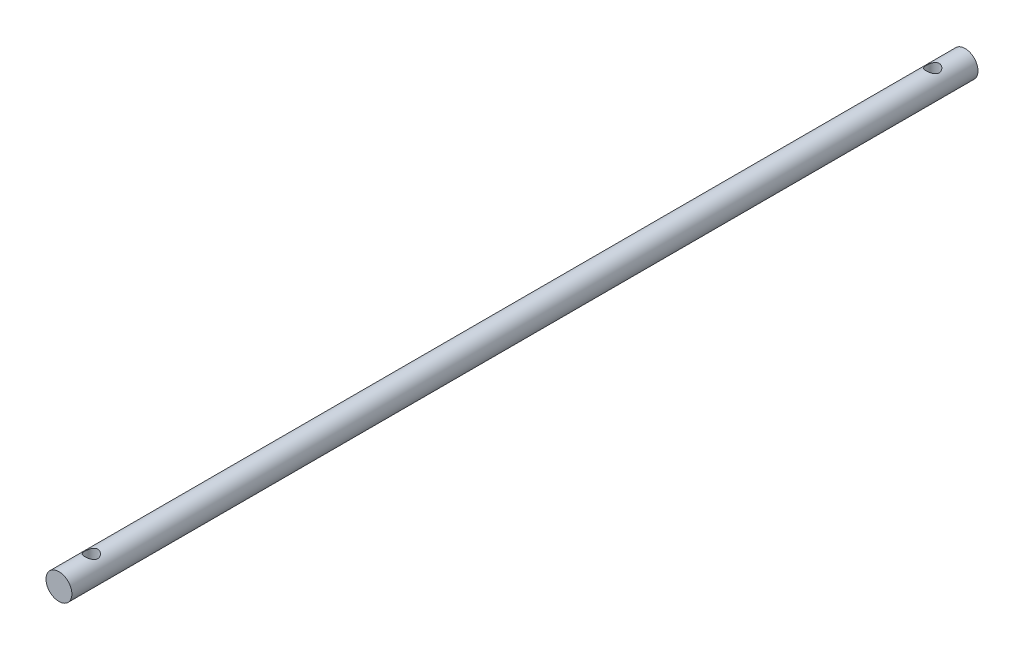
ISO-10303-21;
HEADER;
FILE_DESCRIPTION(('STEP AP214'),'2;1');
FILE_NAME('part.step','',(''),(''),'','','');
FILE_SCHEMA(('AUTOMOTIVE_DESIGN { 1 0 10303 214 1 1 1 1 }'));
ENDSEC;
DATA;
#1=APPLICATION_CONTEXT('core data for automotive mechanical design processes');
#2=APPLICATION_PROTOCOL_DEFINITION('international standard','automotive_design',2000,#1);
#3=PRODUCT_CONTEXT('',#1,'mechanical');
#4=PRODUCT('Part','Part','',(#3));
#5=PRODUCT_RELATED_PRODUCT_CATEGORY('part','',(#4));
#6=PRODUCT_DEFINITION_FORMATION('','',#4);
#7=PRODUCT_DEFINITION_CONTEXT('part definition',#1,'design');
#8=PRODUCT_DEFINITION('design','',#6,#7);
#9=PRODUCT_DEFINITION_SHAPE('','',#8);
#10=(LENGTH_UNIT() NAMED_UNIT(*) SI_UNIT(.MILLI.,.METRE.));
#11=(NAMED_UNIT(*) PLANE_ANGLE_UNIT() SI_UNIT($,.RADIAN.));
#12=(NAMED_UNIT(*) SI_UNIT($,.STERADIAN.) SOLID_ANGLE_UNIT());
#13=UNCERTAINTY_MEASURE_WITH_UNIT(LENGTH_MEASURE(1.E-05),#10,'distance_accuracy_value','');
#14=(GEOMETRIC_REPRESENTATION_CONTEXT(3) GLOBAL_UNCERTAINTY_ASSIGNED_CONTEXT((#13)) GLOBAL_UNIT_ASSIGNED_CONTEXT((#10,
#11,#12)) REPRESENTATION_CONTEXT('',''));
#15=CARTESIAN_POINT('',(0.,0.,0.));
#16=DIRECTION('',(0.,0.,1.));
#17=DIRECTION('',(1.,0.,0.));
#18=AXIS2_PLACEMENT_3D('',#15,#16,#17);
#19=CARTESIAN_POINT('',(0.,0.,280.));
#20=DIRECTION('',(0.,0.,-1.));
#21=DIRECTION('',(-1.,0.,0.));
#22=AXIS2_PLACEMENT_3D('',#19,#20,#21);
#23=CYLINDRICAL_SURFACE('',#22,4.);
#24=CARTESIAN_POINT('',(0.,4.,8.00000000000001));
#25=CARTESIAN_POINT('',(0.105143925902467,3.99999426810082,8.00000660463439));
#26=CARTESIAN_POINT('',(0.210413199395124,3.99580982039513,8.00834014624212));
#27=CARTESIAN_POINT('',(0.417840470537791,3.97948312074314,8.04130576068308));
#28=CARTESIAN_POINT('',(0.519992173427257,3.96732575657839,8.06596878599564));
#29=CARTESIAN_POINT('',(0.717867089760895,3.93632558806751,8.13038761723327));
#30=CARTESIAN_POINT('',(0.813613605878289,3.91750878355075,8.17008476849595));
#31=CARTESIAN_POINT('',(0.996945233613194,3.87491553031523,8.26314124272998));
#32=CARTESIAN_POINT('',(1.08453098798011,3.85113947267051,8.31649948849774));
#33=CARTESIAN_POINT('',(1.25501563552381,3.79912516516124,8.43903449897058));
#34=CARTESIAN_POINT('',(1.33731042224421,3.77070398255074,8.50897295847928));
#35=CARTESIAN_POINT('',(1.48955888973395,3.71319940493486,8.66104295849408));
#36=CARTESIAN_POINT('',(1.55950316621353,3.6841155241807,8.74318370354489));
#37=CARTESIAN_POINT('',(1.69050400090055,3.62597902394695,8.92496669904677));
#38=CARTESIAN_POINT('',(1.75045067110327,3.59710373940264,9.02547219669183));
#39=CARTESIAN_POINT('',(1.85233645378138,3.54571957544641,9.23673467197243));
#40=CARTESIAN_POINT('',(1.89428842993266,3.5232061521398,9.3474842574455));
#41=CARTESIAN_POINT('',(1.95626488437717,3.48915734075618,9.56933021084385));
#42=CARTESIAN_POINT('',(1.97745171416087,3.47704543167428,9.68000890413479));
#43=CARTESIAN_POINT('',(2.00085398661768,3.46363779897056,9.90395767555896));
#44=CARTESIAN_POINT('',(2.00308817674614,3.46233138686577,10.0172250817423));
#45=CARTESIAN_POINT('',(1.98937457434458,3.47021860514497,10.2285720486307));
#46=CARTESIAN_POINT('',(1.97556911907363,3.47817527324028,10.3268480624461));
#47=CARTESIAN_POINT('',(1.93387969811386,3.50152457467701,10.5194438187461));
#48=CARTESIAN_POINT('',(1.90599124779529,3.51691957663553,10.6137622906106));
#49=CARTESIAN_POINT('',(1.836419560772,3.55374952825483,10.7984582651313));
#50=CARTESIAN_POINT('',(1.79443013423198,3.57531681327997,10.8886927975716));
#51=CARTESIAN_POINT('',(1.698083375336,3.62206808562808,11.06126858518));
#52=CARTESIAN_POINT('',(1.64372048762493,3.64725369560382,11.1436062712002));
#53=CARTESIAN_POINT('',(1.51613210982557,3.70226315806572,11.3090425054864));
#54=CARTESIAN_POINT('',(1.44138891673856,3.73227020473493,11.3909137471523));
#55=CARTESIAN_POINT('',(1.27911115748274,3.79095246600815,11.5414708371818));
#56=CARTESIAN_POINT('',(1.19157051314856,3.81962703917602,11.6101503840678));
#57=CARTESIAN_POINT('',(1.00103301166369,3.87403974565928,11.7353713220594));
#58=CARTESIAN_POINT('',(0.897507183198813,3.89957968324015,11.7912009448915));
#59=CARTESIAN_POINT('',(0.68093243097759,3.94315762242485,11.884194058086));
#60=CARTESIAN_POINT('',(0.567891152530549,3.96120157887106,11.9213723700303));
#61=CARTESIAN_POINT('',(0.345532983321403,3.98648667482871,11.9729508074333));
#62=CARTESIAN_POINT('',(0.236683061096651,3.9944987660262,11.9889824714936));
#63=CARTESIAN_POINT('',(0.0175591998987025,4.00146026918207,12.002929462269));
#64=CARTESIAN_POINT('',(-0.092714039739818,4.00041397442637,12.0008533712789));
#65=CARTESIAN_POINT('',(-0.302465943971974,3.9898238450687,11.9795866231625));
#66=CARTESIAN_POINT('',(-0.40211881609986,3.98094491376337,11.96173493454));
#67=CARTESIAN_POINT('',(-0.596813784603881,3.95644342629681,11.9115238562097));
#68=CARTESIAN_POINT('',(-0.691855371382173,3.94082012668824,11.879162867093));
#69=CARTESIAN_POINT('',(-0.877777216899143,3.90368502827176,11.8000030671339));
#70=CARTESIAN_POINT('',(-0.968460794011604,3.88201763539262,11.7528178997674));
#71=CARTESIAN_POINT('',(-1.14092272339854,3.83487948634835,11.6457849287069));
#72=CARTESIAN_POINT('',(-1.22269725955318,3.80940711133877,11.5859317308092));
#73=CARTESIAN_POINT('',(-1.38353537857843,3.75416442672396,11.4484791493386));
#74=CARTESIAN_POINT('',(-1.46154415563805,3.72421769686999,11.3697142631097));
#75=CARTESIAN_POINT('',(-1.6037126422377,3.6652478321764,11.2001496974445));
#76=CARTESIAN_POINT('',(-1.66786277142374,3.63622534800094,11.1093417623042));
#77=CARTESIAN_POINT('',(-1.78341582895803,3.58102384412979,10.912712691654));
#78=CARTESIAN_POINT('',(-1.83405099160049,3.55505059178122,10.806377467811));
#79=CARTESIAN_POINT('',(-1.9161656518694,3.5114814458827,10.5849798648501));
#80=CARTESIAN_POINT('',(-1.94766983173402,3.493874764435,10.4699289470662));
#81=CARTESIAN_POINT('',(-1.98772337493374,3.47123002051604,10.2461795542306));
#82=CARTESIAN_POINT('',(-1.99818599281089,3.4651476693013,10.1379314931295));
#83=CARTESIAN_POINT('',(-2.0013783087524,3.46330709283207,9.92110586567095));
#84=CARTESIAN_POINT('',(-1.99411569324647,3.46754439252781,9.81252846252428));
#85=CARTESIAN_POINT('',(-1.96385225118661,3.48475724102154,9.60903299693313));
#86=CARTESIAN_POINT('',(-1.94241662868606,3.49686188965317,9.51379905971052));
#87=CARTESIAN_POINT('',(-1.88635071644881,3.52742032375306,9.32838376115127));
#88=CARTESIAN_POINT('',(-1.85171618231983,3.54587615139337,9.23820403581594));
#89=CARTESIAN_POINT('',(-1.76763149060112,3.58857060729072,9.05875029802693));
#90=CARTESIAN_POINT('',(-1.71734227563139,3.61311444791841,8.96994419634195));
#91=CARTESIAN_POINT('',(-1.60430194327478,3.66470663269721,8.80145092763749));
#92=CARTESIAN_POINT('',(-1.54154434248311,3.69175627591222,8.72176853895778));
#93=CARTESIAN_POINT('',(-1.39640665332274,3.74924646316185,8.56371603529066));
#94=CARTESIAN_POINT('',(-1.31256884599451,3.77969966613257,8.48668179529943));
#95=CARTESIAN_POINT('',(-1.13230961246639,3.83755504519862,8.34747403312947));
#96=CARTESIAN_POINT('',(-1.03588144661039,3.8649555725239,8.28530852106019));
#97=CARTESIAN_POINT('',(-0.831863193565884,3.91396019133075,8.17752727457587));
#98=CARTESIAN_POINT('',(-0.724199007553455,3.93552192987866,8.13203166152707));
#99=CARTESIAN_POINT('',(-0.501484202276167,3.97002682597974,8.06038366448519));
#100=CARTESIAN_POINT('',(-0.386455599178194,3.98299446726136,8.03417630638858));
#101=CARTESIAN_POINT('',(-0.225203892981785,3.99390923826956,8.01220517782853));
#102=CARTESIAN_POINT('',(-0.180323758883125,3.99618730680502,8.00763471826733));
#103=CARTESIAN_POINT('',(-0.0903034636101807,3.99923393953631,8.00153066897184));
#104=CARTESIAN_POINT('',(-0.0451632952932556,4.00000246206762,7.99999716305959));
#105=CARTESIAN_POINT('',(0.,4.,8.00000000000001));
#106=B_SPLINE_CURVE_WITH_KNOTS('',3,(#24,#25,#26,#27,#28,#29,#30,#31,#32,#33,#34,#35,#36,#37,
#38,#39,#40,#41,#42,#43,#44,#45,#46,#47,#48,#49,#50,#51,#52,#53,#54,#55,#56,#57,#58,#59,#60,#61,
#62,#63,#64,#65,#66,#67,#68,#69,#70,#71,#72,#73,#74,#75,#76,#77,#78,#79,#80,#81,#82,#83,#84,#85,
#86,#87,#88,#89,#90,#91,#92,#93,#94,#95,#96,#97,#98,#99,#100,#101,#102,#103,#104,#105),
.UNSPECIFIED.,.T.,.F.,(4,2,2,2,2,2,2,2,2,2,2,2,2,2,2,2,2,2,2,2,2,2,2,2,2,2,2,2,2,2,2,2,2,2,2,2,
2,2,2,2,4),(0.,0.315248514840584,0.631096299418393,0.945724310984593,1.26032752116313,
1.59396351743617,1.92785247530806,2.28763452861505,2.64715895796561,2.98516024280458,
3.32282714658039,3.6201142481864,3.91749607851355,4.22180480336973,4.52625042520442,
4.86929882667755,5.2125106919737,5.57166044428879,5.93052433824556,6.25966580942688,
6.58865129022949,6.89213813012241,7.1956584326186,7.50785712055794,7.82018901496675,
8.16319221288834,8.5064317723086,8.86629364323447,9.22569023890897,9.55058615006089,
9.87534119729352,10.1691586049771,10.463070575767,10.7767291356057,11.0905512228726,
11.4425048551434,11.7946476676249,12.1492802732705,12.5028981724229,12.6383056026783,
12.7737167702213),.UNSPECIFIED.);
#107=CARTESIAN_POINT('',(0.,4.,8.00000000000001));
#108=VERTEX_POINT('',#107);
#109=EDGE_CURVE('E10',#108,#108,#106,.T.);
#110=ORIENTED_EDGE('',*,*,#109,.T.);
#111=EDGE_LOOP('',(#110));
#112=FACE_BOUND('',#111,.T.);
#113=CARTESIAN_POINT('',(0.,4.,268.));
#114=CARTESIAN_POINT('',(0.105143925902465,3.99999426810082,268.000006604634));
#115=CARTESIAN_POINT('',(0.21041319939512,3.99580982039513,268.008340146242));
#116=CARTESIAN_POINT('',(0.417840470537787,3.97948312074314,268.041305760683));
#117=CARTESIAN_POINT('',(0.519992173427257,3.96732575657839,268.065968785996));
#118=CARTESIAN_POINT('',(0.71786708976089,3.93632558806751,268.130387617233));
#119=CARTESIAN_POINT('',(0.813613605878276,3.91750878355075,268.170084768496));
#120=CARTESIAN_POINT('',(0.996945233613181,3.87491553031523,268.26314124273));
#121=CARTESIAN_POINT('',(1.08453098798011,3.85113947267051,268.316499488498));
#122=CARTESIAN_POINT('',(1.2550156355238,3.79912516516124,268.439034498971));
#123=CARTESIAN_POINT('',(1.33731042224419,3.77070398255076,268.508972958479));
#124=CARTESIAN_POINT('',(1.48955888973393,3.71319940493487,268.661042958494));
#125=CARTESIAN_POINT('',(1.55950316621352,3.6841155241807,268.743183703545));
#126=CARTESIAN_POINT('',(1.69050400090055,3.62597902394695,268.924966699047));
#127=CARTESIAN_POINT('',(1.75045067110326,3.59710373940265,269.025472196692));
#128=CARTESIAN_POINT('',(1.85233645378137,3.54571957544642,269.236734671972));
#129=CARTESIAN_POINT('',(1.89428842993264,3.5232061521398,269.347484257446));
#130=CARTESIAN_POINT('',(1.95626488437715,3.48915734075618,269.569330210844));
#131=CARTESIAN_POINT('',(1.97745171416086,3.47704543167428,269.680008904135));
#132=CARTESIAN_POINT('',(2.00085398661768,3.46363779897056,269.903957675559));
#133=CARTESIAN_POINT('',(2.00308817674614,3.46233138686576,270.017225081742));
#134=CARTESIAN_POINT('',(1.98937457434458,3.47021860514497,270.228572048631));
#135=CARTESIAN_POINT('',(1.97556911907364,3.47817527324027,270.326848062446));
#136=CARTESIAN_POINT('',(1.93387969811387,3.501524574677,270.519443818746));
#137=CARTESIAN_POINT('',(1.9059912477953,3.51691957663553,270.613762290611));
#138=CARTESIAN_POINT('',(1.836419560772,3.55374952825482,270.798458265131));
#139=CARTESIAN_POINT('',(1.79443013423199,3.57531681327997,270.888692797572));
#140=CARTESIAN_POINT('',(1.69808337533601,3.62206808562807,271.06126858518));
#141=CARTESIAN_POINT('',(1.64372048762494,3.64725369560381,271.1436062712));
#142=CARTESIAN_POINT('',(1.51613210982559,3.70226315806571,271.309042505487));
#143=CARTESIAN_POINT('',(1.44138891673858,3.73227020473492,271.390913747152));
#144=CARTESIAN_POINT('',(1.27911115748277,3.79095246600814,271.541470837182));
#145=CARTESIAN_POINT('',(1.1915705131486,3.81962703917601,271.610150384068));
#146=CARTESIAN_POINT('',(1.00103301166373,3.87403974565927,271.735371322059));
#147=CARTESIAN_POINT('',(0.897507183198855,3.89957968324014,271.791200944891));
#148=CARTESIAN_POINT('',(0.680932430977628,3.94315762242484,271.884194058086));
#149=CARTESIAN_POINT('',(0.567891152530584,3.96120157887106,271.92137237003));
#150=CARTESIAN_POINT('',(0.34553298332143,3.98648667482871,271.972950807433));
#151=CARTESIAN_POINT('',(0.236683061096674,3.9944987660262,271.988982471494));
#152=CARTESIAN_POINT('',(0.0175591998987177,4.00146026918207,272.002929462269));
#153=CARTESIAN_POINT('',(-0.0927140397398067,4.00041397442638,272.000853371279));
#154=CARTESIAN_POINT('',(-0.302465943971963,3.9898238450687,271.979586623163));
#155=CARTESIAN_POINT('',(-0.402118816099846,3.98094491376337,271.96173493454));
#156=CARTESIAN_POINT('',(-0.596813784603866,3.95644342629681,271.91152385621));
#157=CARTESIAN_POINT('',(-0.691855371382159,3.94082012668824,271.879162867093));
#158=CARTESIAN_POINT('',(-0.877777216899126,3.90368502827176,271.800003067134));
#159=CARTESIAN_POINT('',(-0.968460794011582,3.88201763539262,271.752817899767));
#160=CARTESIAN_POINT('',(-1.14092272339853,3.83487948634836,271.645784928707));
#161=CARTESIAN_POINT('',(-1.22269725955318,3.80940711133877,271.585931730809));
#162=CARTESIAN_POINT('',(-1.38353537857844,3.75416442672396,271.448479149339));
#163=CARTESIAN_POINT('',(-1.46154415563806,3.72421769686998,271.36971426311));
#164=CARTESIAN_POINT('',(-1.60371264223771,3.6652478321764,271.200149697445));
#165=CARTESIAN_POINT('',(-1.66786277142375,3.63622534800094,271.109341762304));
#166=CARTESIAN_POINT('',(-1.78341582895804,3.58102384412978,270.912712691654));
#167=CARTESIAN_POINT('',(-1.83405099160049,3.55505059178122,270.806377467811));
#168=CARTESIAN_POINT('',(-1.9161656518694,3.5114814458827,270.58497986485));
#169=CARTESIAN_POINT('',(-1.94766983173402,3.493874764435,270.469928947066));
#170=CARTESIAN_POINT('',(-1.98772337493373,3.47123002051605,270.246179554231));
#171=CARTESIAN_POINT('',(-1.99818599281089,3.46514766930131,270.13793149313));
#172=CARTESIAN_POINT('',(-2.0013783087524,3.46330709283207,269.921105865671));
#173=CARTESIAN_POINT('',(-1.99411569324648,3.4675443925278,269.812528462524));
#174=CARTESIAN_POINT('',(-1.96385225118662,3.48475724102153,269.609032996933));
#175=CARTESIAN_POINT('',(-1.94241662868606,3.49686188965317,269.513799059711));
#176=CARTESIAN_POINT('',(-1.88635071644881,3.52742032375306,269.328383761151));
#177=CARTESIAN_POINT('',(-1.85171618231983,3.54587615139338,269.238204035816));
#178=CARTESIAN_POINT('',(-1.76763149060111,3.58857060729072,269.058750298027));
#179=CARTESIAN_POINT('',(-1.71734227563139,3.61311444791841,268.969944196342));
#180=CARTESIAN_POINT('',(-1.60430194327479,3.66470663269721,268.801450927637));
#181=CARTESIAN_POINT('',(-1.54154434248313,3.69175627591221,268.721768538958));
#182=CARTESIAN_POINT('',(-1.39640665332276,3.74924646316184,268.563716035291));
#183=CARTESIAN_POINT('',(-1.31256884599454,3.77969966613256,268.486681795299));
#184=CARTESIAN_POINT('',(-1.13230961246641,3.83755504519861,268.347474033129));
#185=CARTESIAN_POINT('',(-1.03588144661041,3.8649555725239,268.28530852106));
#186=CARTESIAN_POINT('',(-0.831863193565899,3.91396019133075,268.177527274576));
#187=CARTESIAN_POINT('',(-0.72419900755347,3.93552192987866,268.132031661527));
#188=CARTESIAN_POINT('',(-0.501484202276176,3.97002682597974,268.060383664485));
#189=CARTESIAN_POINT('',(-0.386455599178196,3.98299446726136,268.034176306389));
#190=CARTESIAN_POINT('',(-0.22520389298178,3.99390923826956,268.012205177829));
#191=CARTESIAN_POINT('',(-0.180323758883121,3.99618730680502,268.007634718267));
#192=CARTESIAN_POINT('',(-0.0903034636101788,3.99923393953631,268.001530668972));
#193=CARTESIAN_POINT('',(-0.0451632952932545,4.00000246206762,267.99999716306));
#194=CARTESIAN_POINT('',(0.,4.,268.));
#195=B_SPLINE_CURVE_WITH_KNOTS('',3,(#113,#114,#115,#116,#117,#118,#119,#120,#121,#122,#123,
#124,#125,#126,#127,#128,#129,#130,#131,#132,#133,#134,#135,#136,#137,#138,#139,#140,#141,#142,
#143,#144,#145,#146,#147,#148,#149,#150,#151,#152,#153,#154,#155,#156,#157,#158,#159,#160,#161,
#162,#163,#164,#165,#166,#167,#168,#169,#170,#171,#172,#173,#174,#175,#176,#177,#178,#179,#180,
#181,#182,#183,#184,#185,#186,#187,#188,#189,#190,#191,#192,#193,#194),.UNSPECIFIED.,.T.,.F.,(4,
2,2,2,2,2,2,2,2,2,2,2,2,2,2,2,2,2,2,2,2,2,2,2,2,2,2,2,2,2,2,2,2,2,2,2,2,2,2,2,4),(0.,
0.315248514840585,0.631096299418379,0.94572431098458,1.26032752116313,1.59396351743613,
1.92785247530804,2.287634528615,2.64715895796558,2.98516024280451,3.32282714658039,
3.62011424818633,3.91749607851353,4.22180480336971,4.52625042520441,4.86929882667752,
5.21251069197366,5.57166044428874,5.93052433824553,6.25966580942686,6.58865129022948,
6.89213813012238,7.1956584326186,7.50785712055793,7.82018901496675,8.16319221288838,
8.50643177230861,8.86629364323449,9.22569023890897,9.55058615006082,9.87534119729351,
10.1691586049771,10.463070575767,10.7767291356057,11.0905512228726,11.4425048551434,
11.7946476676248,12.1492802732705,12.5028981724229,12.6383056026783,12.7737167702213),.UNSPECIFIED.);
#196=CARTESIAN_POINT('',(0.,4.,268.));
#197=VERTEX_POINT('',#196);
#198=EDGE_CURVE('E41',#197,#197,#195,.T.);
#199=ORIENTED_EDGE('',*,*,#198,.T.);
#200=EDGE_LOOP('',(#199));
#201=FACE_BOUND('',#200,.T.);
#202=CARTESIAN_POINT('',(0.,0.,280.));
#203=DIRECTION('',(0.,0.,1.));
#204=DIRECTION('',(1.,0.,0.));
#205=AXIS2_PLACEMENT_3D('',#202,#203,#204);
#206=CIRCLE('',#205,4.);
#207=CARTESIAN_POINT('',(4.,0.,280.));
#208=VERTEX_POINT('',#207);
#209=EDGE_CURVE('E45',#208,#208,#206,.T.);
#210=ORIENTED_EDGE('',*,*,#209,.F.);
#211=EDGE_LOOP('',(#210));
#212=FACE_BOUND('',#211,.T.);
#213=CARTESIAN_POINT('',(0.,0.,0.));
#214=DIRECTION('',(0.,0.,1.));
#215=DIRECTION('',(1.,0.,0.));
#216=AXIS2_PLACEMENT_3D('',#213,#214,#215);
#217=CIRCLE('',#216,4.);
#218=CARTESIAN_POINT('',(4.,0.,0.));
#219=VERTEX_POINT('',#218);
#220=EDGE_CURVE('E49',#219,#219,#217,.T.);
#221=ORIENTED_EDGE('',*,*,#220,.T.);
#222=EDGE_LOOP('',(#221));
#223=FACE_BOUND('',#222,.T.);
#224=ADVANCED_FACE('F31',(#112,#201,#212,#223),#23,.T.);
#225=CARTESIAN_POINT('',(0.,0.,280.));
#226=DIRECTION('',(0.,0.,1.));
#227=DIRECTION('',(1.,0.,0.));
#228=AXIS2_PLACEMENT_3D('',#225,#226,#227);
#229=PLANE('',#228);
#230=ORIENTED_EDGE('',*,*,#209,.T.);
#231=EDGE_LOOP('',(#230));
#232=FACE_BOUND('',#231,.T.);
#233=ADVANCED_FACE('F68',(#232),#229,.T.);
#234=CARTESIAN_POINT('',(0.,0.,0.));
#235=DIRECTION('',(0.,0.,1.));
#236=DIRECTION('',(1.,0.,0.));
#237=AXIS2_PLACEMENT_3D('',#234,#235,#236);
#238=PLANE('',#237);
#239=ORIENTED_EDGE('',*,*,#220,.F.);
#240=EDGE_LOOP('',(#239));
#241=FACE_BOUND('',#240,.T.);
#242=ADVANCED_FACE('F61',(#241),#238,.F.);
#243=CARTESIAN_POINT('',(0.,0.,270.));
#244=DIRECTION('',(0.,-1.,0.));
#245=DIRECTION('',(0.,0.,-1.));
#246=AXIS2_PLACEMENT_3D('',#243,#244,#245);
#247=CYLINDRICAL_SURFACE('',#246,1.99999999999999);
#248=CARTESIAN_POINT('',(0.,0.,270.));
#249=DIRECTION('',(0.,-1.,0.));
#250=DIRECTION('',(0.,0.,-1.));
#251=AXIS2_PLACEMENT_3D('',#248,#249,#250);
#252=CIRCLE('',#251,1.99999999999999);
#253=CARTESIAN_POINT('',(0.,0.,268.));
#254=VERTEX_POINT('',#253);
#255=EDGE_CURVE('E83',#254,#254,#252,.T.);
#256=ORIENTED_EDGE('',*,*,#255,.T.);
#257=EDGE_LOOP('',(#256));
#258=FACE_BOUND('',#257,.T.);
#259=ORIENTED_EDGE('',*,*,#198,.F.);
#260=EDGE_LOOP('',(#259));
#261=FACE_BOUND('',#260,.T.);
#262=ADVANCED_FACE('F55',(#258,#261),#247,.F.);
#263=CARTESIAN_POINT('',(1.99999999999999,0.,270.));
#264=DIRECTION('',(0.,-1.,0.));
#265=DIRECTION('',(0.,0.,-1.));
#266=AXIS2_PLACEMENT_3D('',#263,#264,#265);
#267=PLANE('',#266);
#268=ORIENTED_EDGE('',*,*,#255,.F.);
#269=EDGE_LOOP('',(#268));
#270=FACE_BOUND('',#269,.T.);
#271=ADVANCED_FACE('F60',(#270),#267,.F.);
#272=CARTESIAN_POINT('',(0.,0.,10.));
#273=DIRECTION('',(0.,-1.,0.));
#274=DIRECTION('',(0.,0.,-1.));
#275=AXIS2_PLACEMENT_3D('',#272,#273,#274);
#276=CYLINDRICAL_SURFACE('',#275,1.99999999999999);
#277=CARTESIAN_POINT('',(0.,0.,10.));
#278=DIRECTION('',(0.,-1.,0.));
#279=DIRECTION('',(0.,0.,-1.));
#280=AXIS2_PLACEMENT_3D('',#277,#278,#279);
#281=CIRCLE('',#280,1.99999999999999);
#282=CARTESIAN_POINT('',(0.,0.,8.00000000000001));
#283=VERTEX_POINT('',#282);
#284=EDGE_CURVE('E85',#283,#283,#281,.T.);
#285=ORIENTED_EDGE('',*,*,#284,.T.);
#286=EDGE_LOOP('',(#285));
#287=FACE_BOUND('',#286,.T.);
#288=ORIENTED_EDGE('',*,*,#109,.F.);
#289=EDGE_LOOP('',(#288));
#290=FACE_BOUND('',#289,.T.);
#291=ADVANCED_FACE('F66',(#287,#290),#276,.F.);
#292=CARTESIAN_POINT('',(1.99999999999999,0.,10.));
#293=DIRECTION('',(0.,-1.,0.));
#294=DIRECTION('',(0.,0.,-1.));
#295=AXIS2_PLACEMENT_3D('',#292,#293,#294);
#296=PLANE('',#295);
#297=ORIENTED_EDGE('',*,*,#284,.F.);
#298=EDGE_LOOP('',(#297));
#299=FACE_BOUND('',#298,.T.);
#300=ADVANCED_FACE('F63',(#299),#296,.F.);
#301=CLOSED_SHELL('',(#224,#233,#242,#262,#271,#291,#300));
#302=MANIFOLD_SOLID_BREP('B2',#301);
#303=ADVANCED_BREP_SHAPE_REPRESENTATION('',(#18,#302),#14);
#304=SHAPE_DEFINITION_REPRESENTATION(#9,#303);
ENDSEC;
END-ISO-10303-21;
